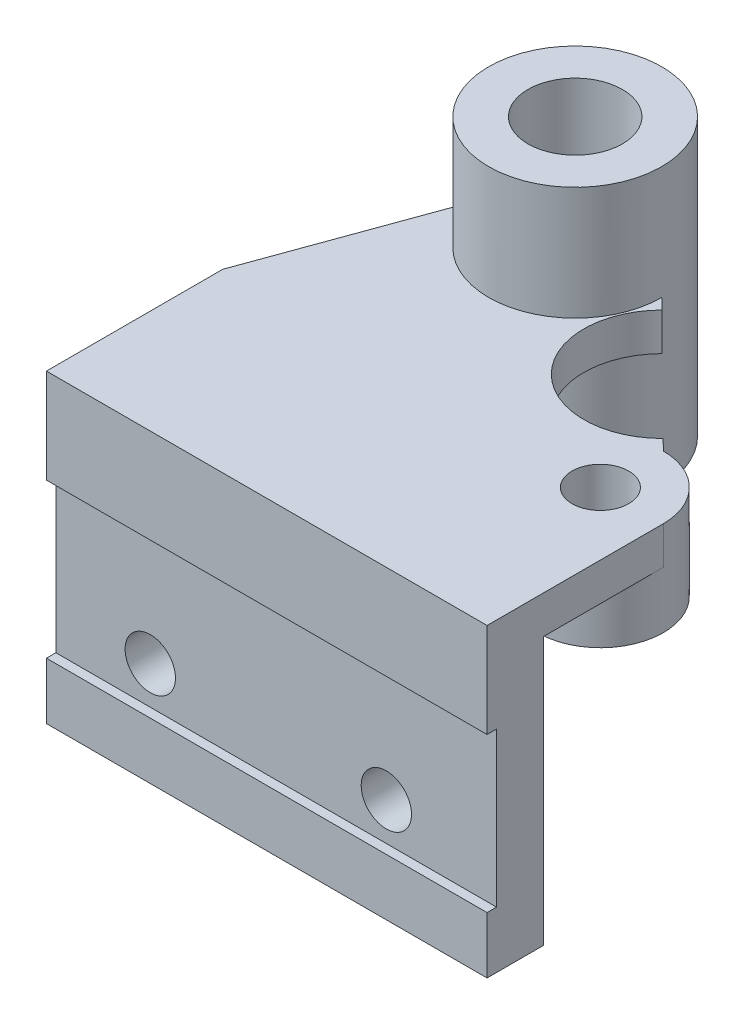
ISO-10303-21;
HEADER;
FILE_DESCRIPTION(('STEP AP214'),'2;1');
FILE_NAME('part.step','',(''),(''),'','','');
FILE_SCHEMA(('AUTOMOTIVE_DESIGN { 1 0 10303 214 1 1 1 1 }'));
ENDSEC;
DATA;
#1=APPLICATION_CONTEXT('core data for automotive mechanical design processes');
#2=APPLICATION_PROTOCOL_DEFINITION('international standard','automotive_design',2000,#1);
#3=PRODUCT_CONTEXT('',#1,'mechanical');
#4=PRODUCT('Part','Part','',(#3));
#5=PRODUCT_RELATED_PRODUCT_CATEGORY('part','',(#4));
#6=PRODUCT_DEFINITION_FORMATION('','',#4);
#7=PRODUCT_DEFINITION_CONTEXT('part definition',#1,'design');
#8=PRODUCT_DEFINITION('design','',#6,#7);
#9=PRODUCT_DEFINITION_SHAPE('','',#8);
#10=(LENGTH_UNIT() NAMED_UNIT(*) SI_UNIT(.MILLI.,.METRE.));
#11=(NAMED_UNIT(*) PLANE_ANGLE_UNIT() SI_UNIT($,.RADIAN.));
#12=(NAMED_UNIT(*) SI_UNIT($,.STERADIAN.) SOLID_ANGLE_UNIT());
#13=UNCERTAINTY_MEASURE_WITH_UNIT(LENGTH_MEASURE(1.E-05),#10,'distance_accuracy_value','');
#14=(GEOMETRIC_REPRESENTATION_CONTEXT(3) GLOBAL_UNCERTAINTY_ASSIGNED_CONTEXT((#13)) GLOBAL_UNIT_ASSIGNED_CONTEXT((#10,
#11,#12)) REPRESENTATION_CONTEXT('',''));
#15=CARTESIAN_POINT('',(0.,0.,0.));
#16=DIRECTION('',(0.,0.,1.));
#17=DIRECTION('',(1.,0.,0.));
#18=AXIS2_PLACEMENT_3D('',#15,#16,#17);
#19=CARTESIAN_POINT('',(77.5,12.,-100.));
#20=DIRECTION('',(0.702910412076563,0.,-0.711278393172712));
#21=DIRECTION('',(-0.711278393172712,0.,-0.702910412076563));
#22=AXIS2_PLACEMENT_3D('',#19,#20,#21);
#23=PLANE('',#22);
#24=DIRECTION('',(0.,1.,0.));
#25=VECTOR('',#24,1.);
#26=CARTESIAN_POINT('',(80.9680401706822,0.,-96.5727603019141));
#27=LINE('',#26,#25);
#28=CARTESIAN_POINT('',(80.9680401706822,0.,-96.5727603019141));
#29=VERTEX_POINT('',#28);
#30=CARTESIAN_POINT('',(80.9680401706822,12.,-96.5727603019141));
#31=VERTEX_POINT('',#30);
#32=EDGE_CURVE('E161',#29,#31,#27,.T.);
#33=ORIENTED_EDGE('',*,*,#32,.F.);
#34=DIRECTION('',(0.711278393172712,0.,0.702910412076563));
#35=VECTOR('',#34,1.);
#36=CARTESIAN_POINT('',(77.5,0.,-100.));
#37=LINE('',#36,#35);
#38=CARTESIAN_POINT('',(77.5,0.,-100.));
#39=VERTEX_POINT('',#38);
#40=EDGE_CURVE('E167',#39,#29,#37,.T.);
#41=ORIENTED_EDGE('',*,*,#40,.F.);
#42=DIRECTION('',(0.,-1.,0.));
#43=VECTOR('',#42,1.);
#44=CARTESIAN_POINT('',(77.5,12.,-100.));
#45=LINE('',#44,#43);
#46=CARTESIAN_POINT('',(77.5,12.,-100.));
#47=VERTEX_POINT('',#46);
#48=EDGE_CURVE('E182',#47,#39,#45,.T.);
#49=ORIENTED_EDGE('',*,*,#48,.F.);
#50=DIRECTION('',(0.711278393172712,0.,0.702910412076563));
#51=VECTOR('',#50,1.);
#52=CARTESIAN_POINT('',(77.5,12.,-100.));
#53=LINE('',#52,#51);
#54=EDGE_CURVE('E187',#47,#31,#53,.T.);
#55=ORIENTED_EDGE('',*,*,#54,.T.);
#56=EDGE_LOOP('',(#33,#41,#49,#55));
#57=FACE_BOUND('',#56,.T.);
#58=ADVANCED_FACE('F49',(#57),#23,.T.);
#59=CARTESIAN_POINT('',(0.,0.,18.));
#60=DIRECTION('',(0.,0.,1.));
#61=DIRECTION('',(1.,0.,0.));
#62=AXIS2_PLACEMENT_3D('',#59,#60,#61);
#63=PLANE('',#62);
#64=DIRECTION('',(-1.,0.,0.));
#65=VECTOR('',#64,1.);
#66=CARTESIAN_POINT('',(0.,-18.,18.));
#67=LINE('',#66,#65);
#68=CARTESIAN_POINT('',(140.,-18.,18.));
#69=VERTEX_POINT('',#68);
#70=CARTESIAN_POINT('',(0.,-18.,18.));
#71=VERTEX_POINT('',#70);
#72=EDGE_CURVE('E58',#69,#71,#67,.T.);
#73=ORIENTED_EDGE('',*,*,#72,.F.);
#74=DIRECTION('',(0.,1.,0.));
#75=VECTOR('',#74,1.);
#76=CARTESIAN_POINT('',(140.,0.,18.));
#77=LINE('',#76,#75);
#78=CARTESIAN_POINT('',(140.,12.,18.));
#79=VERTEX_POINT('',#78);
#80=EDGE_CURVE('E254',#69,#79,#77,.T.);
#81=ORIENTED_EDGE('',*,*,#80,.T.);
#82=DIRECTION('',(1.,0.,0.));
#83=VECTOR('',#82,1.);
#84=CARTESIAN_POINT('',(0.,12.,18.));
#85=LINE('',#84,#83);
#86=CARTESIAN_POINT('',(0.,12.,18.));
#87=VERTEX_POINT('',#86);
#88=EDGE_CURVE('E208',#87,#79,#85,.T.);
#89=ORIENTED_EDGE('',*,*,#88,.F.);
#90=DIRECTION('',(0.,-1.,0.));
#91=VECTOR('',#90,1.);
#92=CARTESIAN_POINT('',(0.,0.,18.));
#93=LINE('',#92,#91);
#94=EDGE_CURVE('E248',#87,#71,#93,.T.);
#95=ORIENTED_EDGE('',*,*,#94,.T.);
#96=EDGE_LOOP('',(#73,#81,#89,#95));
#97=FACE_BOUND('',#96,.T.);
#98=ADVANCED_FACE('F301',(#97),#63,.T.);
#99=CARTESIAN_POINT('',(0.,0.,18.));
#100=DIRECTION('',(1.,0.,0.));
#101=DIRECTION('',(0.,1.,0.));
#102=AXIS2_PLACEMENT_3D('',#99,#100,#101);
#103=PLANE('',#102);
#104=DIRECTION('',(0.,1.,0.));
#105=VECTOR('',#104,1.);
#106=CARTESIAN_POINT('',(0.,0.,15.));
#107=LINE('',#106,#105);
#108=CARTESIAN_POINT('',(0.,-67.,15.));
#109=VERTEX_POINT('',#108);
#110=CARTESIAN_POINT('',(0.,-18.,15.));
#111=VERTEX_POINT('',#110);
#112=EDGE_CURVE('E244',#109,#111,#107,.T.);
#113=ORIENTED_EDGE('',*,*,#112,.T.);
#114=DIRECTION('',(0.,0.,1.));
#115=VECTOR('',#114,1.);
#116=CARTESIAN_POINT('',(0.,-18.,18.));
#117=LINE('',#116,#115);
#118=EDGE_CURVE('E241',#111,#71,#117,.T.);
#119=ORIENTED_EDGE('',*,*,#118,.T.);
#120=ORIENTED_EDGE('',*,*,#94,.F.);
#121=DIRECTION('',(0.,0.,1.));
#122=VECTOR('',#121,1.);
#123=CARTESIAN_POINT('',(0.,12.,18.));
#124=LINE('',#123,#122);
#125=CARTESIAN_POINT('',(0.,12.,-38.));
#126=VERTEX_POINT('',#125);
#127=EDGE_CURVE('E205',#126,#87,#124,.T.);
#128=ORIENTED_EDGE('',*,*,#127,.F.);
#129=DIRECTION('',(0.,1.,0.));
#130=VECTOR('',#129,1.);
#131=CARTESIAN_POINT('',(0.,0.,-38.));
#132=LINE('',#131,#130);
#133=CARTESIAN_POINT('',(0.,0.,-38.));
#134=VERTEX_POINT('',#133);
#135=EDGE_CURVE('E202',#134,#126,#132,.T.);
#136=ORIENTED_EDGE('',*,*,#135,.F.);
#137=DIRECTION('',(0.,0.,-1.));
#138=VECTOR('',#137,1.);
#139=CARTESIAN_POINT('',(0.,0.,18.));
#140=LINE('',#139,#138);
#141=CARTESIAN_POINT('',(0.,0.,0.));
#142=VERTEX_POINT('',#141);
#143=EDGE_CURVE('E199',#142,#134,#140,.T.);
#144=ORIENTED_EDGE('',*,*,#143,.F.);
#145=DIRECTION('',(0.,-1.,0.));
#146=VECTOR('',#145,1.);
#147=CARTESIAN_POINT('',(0.,0.,0.));
#148=LINE('',#147,#146);
#149=CARTESIAN_POINT('',(0.,-85.,0.));
#150=VERTEX_POINT('',#149);
#151=EDGE_CURVE('E247',#142,#150,#148,.T.);
#152=ORIENTED_EDGE('',*,*,#151,.T.);
#153=DIRECTION('',(0.,0.,-1.));
#154=VECTOR('',#153,1.);
#155=CARTESIAN_POINT('',(0.,-85.,18.));
#156=LINE('',#155,#154);
#157=CARTESIAN_POINT('',(0.,-85.,18.));
#158=VERTEX_POINT('',#157);
#159=EDGE_CURVE('E270',#158,#150,#156,.T.);
#160=ORIENTED_EDGE('',*,*,#159,.F.);
#161=CARTESIAN_POINT('',(0.,-67.,18.));
#162=VERTEX_POINT('',#161);
#163=EDGE_CURVE('E252',#162,#158,#93,.T.);
#164=ORIENTED_EDGE('',*,*,#163,.F.);
#165=DIRECTION('',(0.,0.,-1.));
#166=VECTOR('',#165,1.);
#167=CARTESIAN_POINT('',(0.,-67.,18.));
#168=LINE('',#167,#166);
#169=EDGE_CURVE('E237',#162,#109,#168,.T.);
#170=ORIENTED_EDGE('',*,*,#169,.T.);
#171=EDGE_LOOP('',(#113,#119,#120,#128,#136,#144,#152,#160,#164,#170));
#172=FACE_BOUND('',#171,.T.);
#173=ADVANCED_FACE('F51',(#172),#103,.F.);
#174=CARTESIAN_POINT('',(0.,-85.,18.));
#175=DIRECTION('',(0.,1.,0.));
#176=DIRECTION('',(0.,0.,1.));
#177=AXIS2_PLACEMENT_3D('',#174,#175,#176);
#178=PLANE('',#177);
#179=DIRECTION('',(1.,0.,0.));
#180=VECTOR('',#179,1.);
#181=CARTESIAN_POINT('',(0.,-85.,0.));
#182=LINE('',#181,#180);
#183=CARTESIAN_POINT('',(140.,-85.,0.));
#184=VERTEX_POINT('',#183);
#185=EDGE_CURVE('E261',#150,#184,#182,.T.);
#186=ORIENTED_EDGE('',*,*,#185,.T.);
#187=DIRECTION('',(0.,0.,-1.));
#188=VECTOR('',#187,1.);
#189=CARTESIAN_POINT('',(140.,-85.,18.));
#190=LINE('',#189,#188);
#191=CARTESIAN_POINT('',(140.,-85.,18.));
#192=VERTEX_POINT('',#191);
#193=EDGE_CURVE('E258',#192,#184,#190,.T.);
#194=ORIENTED_EDGE('',*,*,#193,.F.);
#195=DIRECTION('',(1.,0.,0.));
#196=VECTOR('',#195,1.);
#197=CARTESIAN_POINT('',(0.,-85.,18.));
#198=LINE('',#197,#196);
#199=EDGE_CURVE('E251',#158,#192,#198,.T.);
#200=ORIENTED_EDGE('',*,*,#199,.F.);
#201=ORIENTED_EDGE('',*,*,#159,.T.);
#202=EDGE_LOOP('',(#186,#194,#200,#201));
#203=FACE_BOUND('',#202,.T.);
#204=ADVANCED_FACE('F368',(#203),#178,.F.);
#205=CARTESIAN_POINT('',(140.,0.,18.));
#206=DIRECTION('',(-1.,0.,0.));
#207=DIRECTION('',(0.,0.,1.));
#208=AXIS2_PLACEMENT_3D('',#205,#206,#207);
#209=PLANE('',#208);
#210=ORIENTED_EDGE('',*,*,#80,.F.);
#211=DIRECTION('',(0.,0.,1.));
#212=VECTOR('',#211,1.);
#213=CARTESIAN_POINT('',(140.,-18.,18.));
#214=LINE('',#213,#212);
#215=CARTESIAN_POINT('',(140.,-18.,15.));
#216=VERTEX_POINT('',#215);
#217=EDGE_CURVE('E232',#216,#69,#214,.T.);
#218=ORIENTED_EDGE('',*,*,#217,.F.);
#219=DIRECTION('',(0.,1.,0.));
#220=VECTOR('',#219,1.);
#221=CARTESIAN_POINT('',(140.,-18.,15.));
#222=LINE('',#221,#220);
#223=CARTESIAN_POINT('',(140.,-67.,15.));
#224=VERTEX_POINT('',#223);
#225=EDGE_CURVE('E228',#224,#216,#222,.T.);
#226=ORIENTED_EDGE('',*,*,#225,.F.);
#227=DIRECTION('',(0.,0.,-1.));
#228=VECTOR('',#227,1.);
#229=CARTESIAN_POINT('',(140.,-67.,18.));
#230=LINE('',#229,#228);
#231=CARTESIAN_POINT('',(140.,-67.,18.));
#232=VERTEX_POINT('',#231);
#233=EDGE_CURVE('E225',#232,#224,#230,.T.);
#234=ORIENTED_EDGE('',*,*,#233,.F.);
#235=EDGE_CURVE('E255',#192,#232,#77,.T.);
#236=ORIENTED_EDGE('',*,*,#235,.F.);
#237=ORIENTED_EDGE('',*,*,#193,.T.);
#238=DIRECTION('',(0.,1.,0.));
#239=VECTOR('',#238,1.);
#240=CARTESIAN_POINT('',(140.,0.,0.));
#241=LINE('',#240,#239);
#242=CARTESIAN_POINT('',(140.,0.,0.));
#243=VERTEX_POINT('',#242);
#244=EDGE_CURVE('E263',#184,#243,#241,.T.);
#245=ORIENTED_EDGE('',*,*,#244,.T.);
#246=DIRECTION('',(0.,0.,-1.));
#247=VECTOR('',#246,1.);
#248=CARTESIAN_POINT('',(140.,0.,18.));
#249=LINE('',#248,#247);
#250=CARTESIAN_POINT('',(140.,0.,-38.));
#251=VERTEX_POINT('',#250);
#252=EDGE_CURVE('E198',#243,#251,#249,.T.);
#253=ORIENTED_EDGE('',*,*,#252,.T.);
#254=DIRECTION('',(0.,1.,0.));
#255=VECTOR('',#254,1.);
#256=CARTESIAN_POINT('',(140.,0.,-38.));
#257=LINE('',#256,#255);
#258=CARTESIAN_POINT('',(140.,12.,-38.));
#259=VERTEX_POINT('',#258);
#260=EDGE_CURVE('E211',#251,#259,#257,.T.);
#261=ORIENTED_EDGE('',*,*,#260,.T.);
#262=DIRECTION('',(0.,0.,1.));
#263=VECTOR('',#262,1.);
#264=CARTESIAN_POINT('',(140.,12.,18.));
#265=LINE('',#264,#263);
#266=EDGE_CURVE('E203',#259,#79,#265,.T.);
#267=ORIENTED_EDGE('',*,*,#266,.T.);
#268=EDGE_LOOP('',(#210,#218,#226,#234,#236,#237,#245,#253,#261,#267));
#269=FACE_BOUND('',#268,.T.);
#270=ADVANCED_FACE('F355',(#269),#209,.F.);
#271=DIRECTION('',(1.,0.,0.));
#272=VECTOR('',#271,1.);
#273=CARTESIAN_POINT('',(0.,-67.,18.));
#274=LINE('',#273,#272);
#275=EDGE_CURVE('E273',#162,#232,#274,.T.);
#276=ORIENTED_EDGE('',*,*,#275,.F.);
#277=ORIENTED_EDGE('',*,*,#163,.T.);
#278=ORIENTED_EDGE('',*,*,#199,.T.);
#279=ORIENTED_EDGE('',*,*,#235,.T.);
#280=EDGE_LOOP('',(#276,#277,#278,#279));
#281=FACE_BOUND('',#280,.T.);
#282=ADVANCED_FACE('F309',(#281),#63,.T.);
#283=CARTESIAN_POINT('',(0.,0.,0.));
#284=DIRECTION('',(0.,0.,1.));
#285=DIRECTION('',(1.,0.,0.));
#286=AXIS2_PLACEMENT_3D('',#283,#284,#285);
#287=PLANE('',#286);
#288=CARTESIAN_POINT('',(105.,-55.,0.));
#289=DIRECTION('',(0.,0.,-1.));
#290=DIRECTION('',(-1.,0.,0.));
#291=AXIS2_PLACEMENT_3D('',#288,#289,#290);
#292=CIRCLE('',#291,8.00000000000001);
#293=CARTESIAN_POINT('',(97.,-55.,0.));
#294=VERTEX_POINT('',#293);
#295=EDGE_CURVE('E219',#294,#294,#292,.T.);
#296=ORIENTED_EDGE('',*,*,#295,.F.);
#297=EDGE_LOOP('',(#296));
#298=FACE_BOUND('',#297,.T.);
#299=CARTESIAN_POINT('',(30.,-55.,0.));
#300=DIRECTION('',(0.,0.,-1.));
#301=DIRECTION('',(-1.,0.,0.));
#302=AXIS2_PLACEMENT_3D('',#299,#300,#301);
#303=CIRCLE('',#302,8.);
#304=CARTESIAN_POINT('',(22.,-55.,0.));
#305=VERTEX_POINT('',#304);
#306=EDGE_CURVE('E218',#305,#305,#303,.T.);
#307=ORIENTED_EDGE('',*,*,#306,.F.);
#308=EDGE_LOOP('',(#307));
#309=FACE_BOUND('',#308,.T.);
#310=ORIENTED_EDGE('',*,*,#151,.F.);
#311=DIRECTION('',(-1.,0.,0.));
#312=VECTOR('',#311,1.);
#313=CARTESIAN_POINT('',(0.,0.,0.));
#314=LINE('',#313,#312);
#315=EDGE_CURVE('E265',#243,#142,#314,.T.);
#316=ORIENTED_EDGE('',*,*,#315,.F.);
#317=ORIENTED_EDGE('',*,*,#244,.F.);
#318=ORIENTED_EDGE('',*,*,#185,.F.);
#319=EDGE_LOOP('',(#310,#316,#317,#318));
#320=FACE_BOUND('',#319,.T.);
#321=ADVANCED_FACE('F390',(#298,#309,#320),#287,.F.);
#322=CARTESIAN_POINT('',(-80.,-18.,15.));
#323=DIRECTION('',(0.,0.,-1.));
#324=DIRECTION('',(-1.,0.,0.));
#325=AXIS2_PLACEMENT_3D('',#322,#323,#324);
#326=PLANE('',#325);
#327=CARTESIAN_POINT('',(105.,-55.,15.));
#328=DIRECTION('',(0.,0.,-1.));
#329=DIRECTION('',(-1.,0.,0.));
#330=AXIS2_PLACEMENT_3D('',#327,#328,#329);
#331=CIRCLE('',#330,8.00000000000001);
#332=CARTESIAN_POINT('',(97.,-55.,15.));
#333=VERTEX_POINT('',#332);
#334=EDGE_CURVE('E229',#333,#333,#331,.T.);
#335=ORIENTED_EDGE('',*,*,#334,.T.);
#336=EDGE_LOOP('',(#335));
#337=FACE_BOUND('',#336,.T.);
#338=CARTESIAN_POINT('',(30.,-55.,15.));
#339=DIRECTION('',(0.,0.,-1.));
#340=DIRECTION('',(-1.,0.,0.));
#341=AXIS2_PLACEMENT_3D('',#338,#339,#340);
#342=CIRCLE('',#341,8.);
#343=CARTESIAN_POINT('',(22.,-55.,15.));
#344=VERTEX_POINT('',#343);
#345=EDGE_CURVE('E222',#344,#344,#342,.T.);
#346=ORIENTED_EDGE('',*,*,#345,.T.);
#347=EDGE_LOOP('',(#346));
#348=FACE_BOUND('',#347,.T.);
#349=DIRECTION('',(1.,0.,0.));
#350=VECTOR('',#349,1.);
#351=CARTESIAN_POINT('',(-80.,-67.,15.));
#352=LINE('',#351,#350);
#353=EDGE_CURVE('E234',#109,#224,#352,.T.);
#354=ORIENTED_EDGE('',*,*,#353,.T.);
#355=ORIENTED_EDGE('',*,*,#225,.T.);
#356=DIRECTION('',(1.,0.,0.));
#357=VECTOR('',#356,1.);
#358=CARTESIAN_POINT('',(-80.,-18.,15.));
#359=LINE('',#358,#357);
#360=EDGE_CURVE('E235',#111,#216,#359,.T.);
#361=ORIENTED_EDGE('',*,*,#360,.F.);
#362=ORIENTED_EDGE('',*,*,#112,.F.);
#363=EDGE_LOOP('',(#354,#355,#361,#362));
#364=FACE_BOUND('',#363,.T.);
#365=ADVANCED_FACE('F281',(#337,#348,#364),#326,.F.);
#366=CARTESIAN_POINT('',(-80.,-18.,18.));
#367=DIRECTION('',(0.,1.,0.));
#368=DIRECTION('',(0.,0.,1.));
#369=AXIS2_PLACEMENT_3D('',#366,#367,#368);
#370=PLANE('',#369);
#371=ORIENTED_EDGE('',*,*,#360,.T.);
#372=ORIENTED_EDGE('',*,*,#217,.T.);
#373=ORIENTED_EDGE('',*,*,#72,.T.);
#374=ORIENTED_EDGE('',*,*,#118,.F.);
#375=EDGE_LOOP('',(#371,#372,#373,#374));
#376=FACE_BOUND('',#375,.T.);
#377=ADVANCED_FACE('F404',(#376),#370,.F.);
#378=CARTESIAN_POINT('',(-80.,-67.,18.));
#379=DIRECTION('',(0.,-1.,0.));
#380=DIRECTION('',(0.,0.,-1.));
#381=AXIS2_PLACEMENT_3D('',#378,#379,#380);
#382=PLANE('',#381);
#383=ORIENTED_EDGE('',*,*,#275,.T.);
#384=ORIENTED_EDGE('',*,*,#233,.T.);
#385=ORIENTED_EDGE('',*,*,#353,.F.);
#386=ORIENTED_EDGE('',*,*,#169,.F.);
#387=EDGE_LOOP('',(#383,#384,#385,#386));
#388=FACE_BOUND('',#387,.T.);
#389=ADVANCED_FACE('F296',(#388),#382,.F.);
#390=CARTESIAN_POINT('',(30.,-55.,29.9999999999999));
#391=DIRECTION('',(0.,0.,-1.));
#392=DIRECTION('',(-1.,0.,0.));
#393=AXIS2_PLACEMENT_3D('',#390,#391,#392);
#394=CYLINDRICAL_SURFACE('',#393,8.);
#395=ORIENTED_EDGE('',*,*,#306,.T.);
#396=EDGE_LOOP('',(#395));
#397=FACE_BOUND('',#396,.T.);
#398=ORIENTED_EDGE('',*,*,#345,.F.);
#399=EDGE_LOOP('',(#398));
#400=FACE_BOUND('',#399,.T.);
#401=ADVANCED_FACE('F287',(#397,#400),#394,.F.);
#402=CARTESIAN_POINT('',(105.,-55.,29.9999999999999));
#403=DIRECTION('',(0.,0.,-1.));
#404=DIRECTION('',(-1.,0.,0.));
#405=AXIS2_PLACEMENT_3D('',#402,#403,#404);
#406=CYLINDRICAL_SURFACE('',#405,8.00000000000001);
#407=ORIENTED_EDGE('',*,*,#295,.T.);
#408=EDGE_LOOP('',(#407));
#409=FACE_BOUND('',#408,.T.);
#410=ORIENTED_EDGE('',*,*,#334,.F.);
#411=EDGE_LOOP('',(#410));
#412=FACE_BOUND('',#411,.T.);
#413=ADVANCED_FACE('F284',(#409,#412),#406,.F.);
#414=CARTESIAN_POINT('',(0.,12.,18.));
#415=DIRECTION('',(0.,1.,0.));
#416=DIRECTION('',(0.,0.,1.));
#417=AXIS2_PLACEMENT_3D('',#414,#415,#416);
#418=PLANE('',#417);
#419=CARTESIAN_POINT('',(98.75,12.,-79.));
#420=DIRECTION('',(0.,1.,0.));
#421=DIRECTION('',(0.,0.,1.));
#422=AXIS2_PLACEMENT_3D('',#419,#420,#421);
#423=CIRCLE('',#422,25.);
#424=CARTESIAN_POINT('',(116.531959829318,12.,-61.4272396980859));
#425=VERTEX_POINT('',#424);
#426=EDGE_CURVE('E65',#31,#425,#423,.T.);
#427=ORIENTED_EDGE('',*,*,#426,.F.);
#428=ORIENTED_EDGE('',*,*,#54,.F.);
#429=CARTESIAN_POINT('',(50.,12.,-100.));
#430=DIRECTION('',(0.,1.,0.));
#431=DIRECTION('',(0.,0.,-1.));
#432=AXIS2_PLACEMENT_3D('',#429,#430,#431);
#433=CIRCLE('',#432,27.5);
#434=CARTESIAN_POINT('',(22.5,12.,-100.));
#435=VERTEX_POINT('',#434);
#436=EDGE_CURVE('E570',#435,#47,#433,.T.);
#437=ORIENTED_EDGE('',*,*,#436,.F.);
#438=DIRECTION('',(0.341134317041086,0.,-0.940014562513215));
#439=VECTOR('',#438,1.);
#440=CARTESIAN_POINT('',(0.,12.,-38.));
#441=LINE('',#440,#439);
#442=EDGE_CURVE('E175',#126,#435,#441,.T.);
#443=ORIENTED_EDGE('',*,*,#442,.F.);
#444=ORIENTED_EDGE('',*,*,#127,.T.);
#445=ORIENTED_EDGE('',*,*,#88,.T.);
#446=ORIENTED_EDGE('',*,*,#266,.F.);
#447=CARTESIAN_POINT('',(120.,12.,-38.));
#448=DIRECTION('',(0.,-1.,0.));
#449=DIRECTION('',(0.,0.,-1.));
#450=AXIS2_PLACEMENT_3D('',#447,#448,#449);
#451=CIRCLE('',#450,20.);
#452=CARTESIAN_POINT('',(120.,12.,-58.));
#453=VERTEX_POINT('',#452);
#454=EDGE_CURVE('E193',#453,#259,#451,.T.);
#455=ORIENTED_EDGE('',*,*,#454,.F.);
#456=EDGE_CURVE('E572',#425,#453,#53,.T.);
#457=ORIENTED_EDGE('',*,*,#456,.F.);
#458=EDGE_LOOP('',(#427,#428,#437,#443,#444,#445,#446,#455,#457));
#459=FACE_BOUND('',#458,.T.);
#460=CARTESIAN_POINT('',(120.000000000002,12.,-38.0000000000055));
#461=DIRECTION('',(0.,1.,0.));
#462=DIRECTION('',(0.,0.,1.));
#463=AXIS2_PLACEMENT_3D('',#460,#461,#462);
#464=CIRCLE('',#463,9.);
#465=CARTESIAN_POINT('',(120.000000000002,12.,-29.0000000000055));
#466=VERTEX_POINT('',#465);
#467=EDGE_CURVE('E190',#466,#466,#464,.T.);
#468=ORIENTED_EDGE('',*,*,#467,.F.);
#469=EDGE_LOOP('',(#468));
#470=FACE_BOUND('',#469,.T.);
#471=ADVANCED_FACE('F286',(#459,#470),#418,.T.);
#472=CARTESIAN_POINT('',(0.,0.,18.));
#473=DIRECTION('',(0.,-1.,0.));
#474=DIRECTION('',(0.,0.,-1.));
#475=AXIS2_PLACEMENT_3D('',#472,#473,#474);
#476=PLANE('',#475);
#477=CARTESIAN_POINT('',(98.75,0.,-79.));
#478=DIRECTION('',(0.,1.,0.));
#479=DIRECTION('',(0.,0.,1.));
#480=AXIS2_PLACEMENT_3D('',#477,#478,#479);
#481=CIRCLE('',#480,25.);
#482=CARTESIAN_POINT('',(116.531959829318,0.,-61.4272396980859));
#483=VERTEX_POINT('',#482);
#484=EDGE_CURVE('E157',#29,#483,#481,.T.);
#485=ORIENTED_EDGE('',*,*,#484,.T.);
#486=CARTESIAN_POINT('',(120.,0.,-58.));
#487=VERTEX_POINT('',#486);
#488=EDGE_CURVE('E72',#483,#487,#37,.T.);
#489=ORIENTED_EDGE('',*,*,#488,.T.);
#490=CARTESIAN_POINT('',(120.,0.,-38.));
#491=DIRECTION('',(0.,-1.,0.));
#492=DIRECTION('',(0.,0.,-1.));
#493=AXIS2_PLACEMENT_3D('',#490,#491,#492);
#494=CIRCLE('',#493,20.);
#495=EDGE_CURVE('E13',#487,#251,#494,.F.);
#496=ORIENTED_EDGE('',*,*,#495,.T.);
#497=ORIENTED_EDGE('',*,*,#252,.F.);
#498=ORIENTED_EDGE('',*,*,#315,.T.);
#499=ORIENTED_EDGE('',*,*,#143,.T.);
#500=DIRECTION('',(0.341134317041086,0.,-0.940014562513215));
#501=VECTOR('',#500,1.);
#502=CARTESIAN_POINT('',(0.,0.,-38.));
#503=LINE('',#502,#501);
#504=CARTESIAN_POINT('',(22.5,0.,-100.));
#505=VERTEX_POINT('',#504);
#506=EDGE_CURVE('E176',#134,#505,#503,.T.);
#507=ORIENTED_EDGE('',*,*,#506,.T.);
#508=CARTESIAN_POINT('',(50.,0.,-100.));
#509=DIRECTION('',(0.,1.,0.));
#510=DIRECTION('',(0.,0.,-1.));
#511=AXIS2_PLACEMENT_3D('',#508,#509,#510);
#512=CIRCLE('',#511,27.5);
#513=EDGE_CURVE('E173',#505,#39,#512,.T.);
#514=ORIENTED_EDGE('',*,*,#513,.T.);
#515=ORIENTED_EDGE('',*,*,#40,.T.);
#516=EDGE_LOOP('',(#485,#489,#496,#497,#498,#499,#507,#514,#515));
#517=FACE_BOUND('',#516,.T.);
#518=ADVANCED_FACE('F164',(#517),#476,.T.);
#519=CARTESIAN_POINT('',(120.,-18.,-38.));
#520=DIRECTION('',(0.,1.,0.));
#521=DIRECTION('',(0.,0.,1.));
#522=AXIS2_PLACEMENT_3D('',#519,#520,#521);
#523=CYLINDRICAL_SURFACE('',#522,20.);
#524=ORIENTED_EDGE('',*,*,#495,.F.);
#525=DIRECTION('',(0.,-1.,0.));
#526=VECTOR('',#525,1.);
#527=CARTESIAN_POINT('',(120.,12.,-58.));
#528=LINE('',#527,#526);
#529=EDGE_CURVE('E172',#453,#487,#528,.T.);
#530=ORIENTED_EDGE('',*,*,#529,.F.);
#531=ORIENTED_EDGE('',*,*,#454,.T.);
#532=ORIENTED_EDGE('',*,*,#260,.F.);
#533=EDGE_LOOP('',(#524,#530,#531,#532));
#534=FACE_BOUND('',#533,.T.);
#535=CARTESIAN_POINT('',(120.,-18.,-38.));
#536=DIRECTION('',(0.,-1.,0.));
#537=DIRECTION('',(0.,0.,-1.));
#538=AXIS2_PLACEMENT_3D('',#535,#536,#537);
#539=CIRCLE('',#538,20.);
#540=CARTESIAN_POINT('',(120.,-18.,-58.));
#541=VERTEX_POINT('',#540);
#542=EDGE_CURVE('E195',#541,#541,#539,.T.);
#543=ORIENTED_EDGE('',*,*,#542,.F.);
#544=EDGE_LOOP('',(#543));
#545=FACE_BOUND('',#544,.T.);
#546=ADVANCED_FACE('F327',(#534,#545),#523,.T.);
#547=CARTESIAN_POINT('',(120.,-18.,-38.));
#548=DIRECTION('',(0.,-1.,0.));
#549=DIRECTION('',(0.,0.,-1.));
#550=AXIS2_PLACEMENT_3D('',#547,#548,#549);
#551=PLANE('',#550);
#552=CARTESIAN_POINT('',(120.000000000002,-18.,-38.0000000000055));
#553=DIRECTION('',(0.,-1.,0.));
#554=DIRECTION('',(0.,0.,-1.));
#555=AXIS2_PLACEMENT_3D('',#552,#553,#554);
#556=CIRCLE('',#555,9.);
#557=CARTESIAN_POINT('',(120.000000000002,-18.,-47.0000000000055));
#558=VERTEX_POINT('',#557);
#559=EDGE_CURVE('E181',#558,#558,#556,.T.);
#560=ORIENTED_EDGE('',*,*,#559,.F.);
#561=EDGE_LOOP('',(#560));
#562=FACE_BOUND('',#561,.T.);
#563=ORIENTED_EDGE('',*,*,#542,.T.);
#564=EDGE_LOOP('',(#563));
#565=FACE_BOUND('',#564,.T.);
#566=ADVANCED_FACE('F321',(#562,#565),#551,.T.);
#567=CARTESIAN_POINT('',(120.000000000002,32.,-38.0000000000055));
#568=DIRECTION('',(0.,-1.,0.));
#569=DIRECTION('',(0.,0.,-1.));
#570=AXIS2_PLACEMENT_3D('',#567,#568,#569);
#571=CYLINDRICAL_SURFACE('',#570,9.);
#572=ORIENTED_EDGE('',*,*,#467,.T.);
#573=EDGE_LOOP('',(#572));
#574=FACE_BOUND('',#573,.T.);
#575=ORIENTED_EDGE('',*,*,#559,.T.);
#576=EDGE_LOOP('',(#575));
#577=FACE_BOUND('',#576,.T.);
#578=ADVANCED_FACE('F314',(#574,#577),#571,.F.);
#579=DIRECTION('',(0.,1.,0.));
#580=VECTOR('',#579,1.);
#581=CARTESIAN_POINT('',(116.531959829318,0.,-61.4272396980859));
#582=LINE('',#581,#580);
#583=EDGE_CURVE('E155',#483,#425,#582,.T.);
#584=ORIENTED_EDGE('',*,*,#583,.T.);
#585=ORIENTED_EDGE('',*,*,#456,.T.);
#586=ORIENTED_EDGE('',*,*,#529,.T.);
#587=ORIENTED_EDGE('',*,*,#488,.F.);
#588=EDGE_LOOP('',(#584,#585,#586,#587));
#589=FACE_BOUND('',#588,.T.);
#590=ADVANCED_FACE('F170',(#589),#23,.T.);
#591=CARTESIAN_POINT('',(0.,12.,-38.));
#592=DIRECTION('',(-0.940014562513215,0.,-0.341134317041086));
#593=DIRECTION('',(-0.341134317041086,0.,0.940014562513216));
#594=AXIS2_PLACEMENT_3D('',#591,#592,#593);
#595=PLANE('',#594);
#596=ORIENTED_EDGE('',*,*,#506,.F.);
#597=ORIENTED_EDGE('',*,*,#135,.T.);
#598=ORIENTED_EDGE('',*,*,#442,.T.);
#599=DIRECTION('',(0.,-1.,0.));
#600=VECTOR('',#599,1.);
#601=CARTESIAN_POINT('',(22.5,12.,-100.));
#602=LINE('',#601,#600);
#603=EDGE_CURVE('E184',#435,#505,#602,.T.);
#604=ORIENTED_EDGE('',*,*,#603,.T.);
#605=EDGE_LOOP('',(#596,#597,#598,#604));
#606=FACE_BOUND('',#605,.T.);
#607=ADVANCED_FACE('F313',(#606),#595,.T.);
#608=CARTESIAN_POINT('',(50.,-40.,-100.));
#609=DIRECTION('',(0.,1.,0.));
#610=DIRECTION('',(0.,0.,1.));
#611=AXIS2_PLACEMENT_3D('',#608,#609,#610);
#612=CYLINDRICAL_SURFACE('',#611,27.5);
#613=ORIENTED_EDGE('',*,*,#436,.T.);
#614=ORIENTED_EDGE('',*,*,#48,.T.);
#615=ORIENTED_EDGE('',*,*,#513,.F.);
#616=ORIENTED_EDGE('',*,*,#603,.F.);
#617=EDGE_LOOP('',(#613,#614,#615,#616));
#618=FACE_BOUND('',#617,.T.);
#619=CARTESIAN_POINT('',(50.,-40.,-100.));
#620=DIRECTION('',(0.,1.,0.));
#621=DIRECTION('',(0.,0.,1.));
#622=AXIS2_PLACEMENT_3D('',#619,#620,#621);
#623=CIRCLE('',#622,27.5);
#624=CARTESIAN_POINT('',(50.,-40.,-72.5));
#625=VERTEX_POINT('',#624);
#626=EDGE_CURVE('E565',#625,#625,#623,.T.);
#627=ORIENTED_EDGE('',*,*,#626,.T.);
#628=EDGE_LOOP('',(#627));
#629=FACE_BOUND('',#628,.T.);
#630=CARTESIAN_POINT('',(50.,48.,-100.));
#631=DIRECTION('',(0.,1.,0.));
#632=DIRECTION('',(0.,0.,1.));
#633=AXIS2_PLACEMENT_3D('',#630,#631,#632);
#634=CIRCLE('',#633,27.5);
#635=CARTESIAN_POINT('',(50.,48.,-72.5));
#636=VERTEX_POINT('',#635);
#637=EDGE_CURVE('E560',#636,#636,#634,.T.);
#638=ORIENTED_EDGE('',*,*,#637,.F.);
#639=EDGE_LOOP('',(#638));
#640=FACE_BOUND('',#639,.T.);
#641=ADVANCED_FACE('F319',(#618,#629,#640),#612,.T.);
#642=CARTESIAN_POINT('',(50.,-40.,-100.));
#643=DIRECTION('',(0.,1.,0.));
#644=DIRECTION('',(0.,0.,1.));
#645=AXIS2_PLACEMENT_3D('',#642,#643,#644);
#646=PLANE('',#645);
#647=CARTESIAN_POINT('',(50.,-40.,-100.));
#648=DIRECTION('',(0.,-1.,0.));
#649=DIRECTION('',(0.,0.,-1.));
#650=AXIS2_PLACEMENT_3D('',#647,#648,#649);
#651=CIRCLE('',#650,15.);
#652=CARTESIAN_POINT('',(50.,-40.,-115.));
#653=VERTEX_POINT('',#652);
#654=EDGE_CURVE('E558',#653,#653,#651,.T.);
#655=ORIENTED_EDGE('',*,*,#654,.F.);
#656=EDGE_LOOP('',(#655));
#657=FACE_BOUND('',#656,.T.);
#658=ORIENTED_EDGE('',*,*,#626,.F.);
#659=EDGE_LOOP('',(#658));
#660=FACE_BOUND('',#659,.T.);
#661=ADVANCED_FACE('F484',(#657,#660),#646,.F.);
#662=CARTESIAN_POINT('',(50.,48.,-100.));
#663=DIRECTION('',(0.,1.,0.));
#664=DIRECTION('',(0.,0.,1.));
#665=AXIS2_PLACEMENT_3D('',#662,#663,#664);
#666=PLANE('',#665);
#667=CARTESIAN_POINT('',(50.,48.,-100.));
#668=DIRECTION('',(0.,1.,0.));
#669=DIRECTION('',(0.,0.,1.));
#670=AXIS2_PLACEMENT_3D('',#667,#668,#669);
#671=CIRCLE('',#670,15.);
#672=CARTESIAN_POINT('',(50.,48.,-85.));
#673=VERTEX_POINT('',#672);
#674=EDGE_CURVE('E53',#673,#673,#671,.T.);
#675=ORIENTED_EDGE('',*,*,#674,.F.);
#676=EDGE_LOOP('',(#675));
#677=FACE_BOUND('',#676,.T.);
#678=ORIENTED_EDGE('',*,*,#637,.T.);
#679=EDGE_LOOP('',(#678));
#680=FACE_BOUND('',#679,.T.);
#681=ADVANCED_FACE('F493',(#677,#680),#666,.T.);
#682=CARTESIAN_POINT('',(50.,69.,-100.));
#683=DIRECTION('',(0.,-1.,0.));
#684=DIRECTION('',(0.,0.,-1.));
#685=AXIS2_PLACEMENT_3D('',#682,#683,#684);
#686=CYLINDRICAL_SURFACE('',#685,15.);
#687=ORIENTED_EDGE('',*,*,#674,.T.);
#688=EDGE_LOOP('',(#687));
#689=FACE_BOUND('',#688,.T.);
#690=ORIENTED_EDGE('',*,*,#654,.T.);
#691=EDGE_LOOP('',(#690));
#692=FACE_BOUND('',#691,.T.);
#693=ADVANCED_FACE('F503',(#689,#692),#686,.F.);
#694=CARTESIAN_POINT('',(98.75,0.,-79.));
#695=DIRECTION('',(0.,1.,0.));
#696=DIRECTION('',(0.,0.,1.));
#697=AXIS2_PLACEMENT_3D('',#694,#695,#696);
#698=CYLINDRICAL_SURFACE('',#697,25.);
#699=ORIENTED_EDGE('',*,*,#426,.T.);
#700=ORIENTED_EDGE('',*,*,#583,.F.);
#701=ORIENTED_EDGE('',*,*,#484,.F.);
#702=ORIENTED_EDGE('',*,*,#32,.T.);
#703=EDGE_LOOP('',(#699,#700,#701,#702));
#704=FACE_BOUND('',#703,.T.);
#705=ADVANCED_FACE('F156',(#704),#698,.F.);
#706=CLOSED_SHELL('',(#58,#98,#173,#204,#270,#282,#321,#365,#377,#389,#401,#413,#471,#518,#546,
#566,#578,#590,#607,#641,#661,#681,#693,#705));
#707=MANIFOLD_SOLID_BREP('B2',#706);
#708=ADVANCED_BREP_SHAPE_REPRESENTATION('',(#18,#707),#14);
#709=SHAPE_DEFINITION_REPRESENTATION(#9,#708);
ENDSEC;
END-ISO-10303-21;
